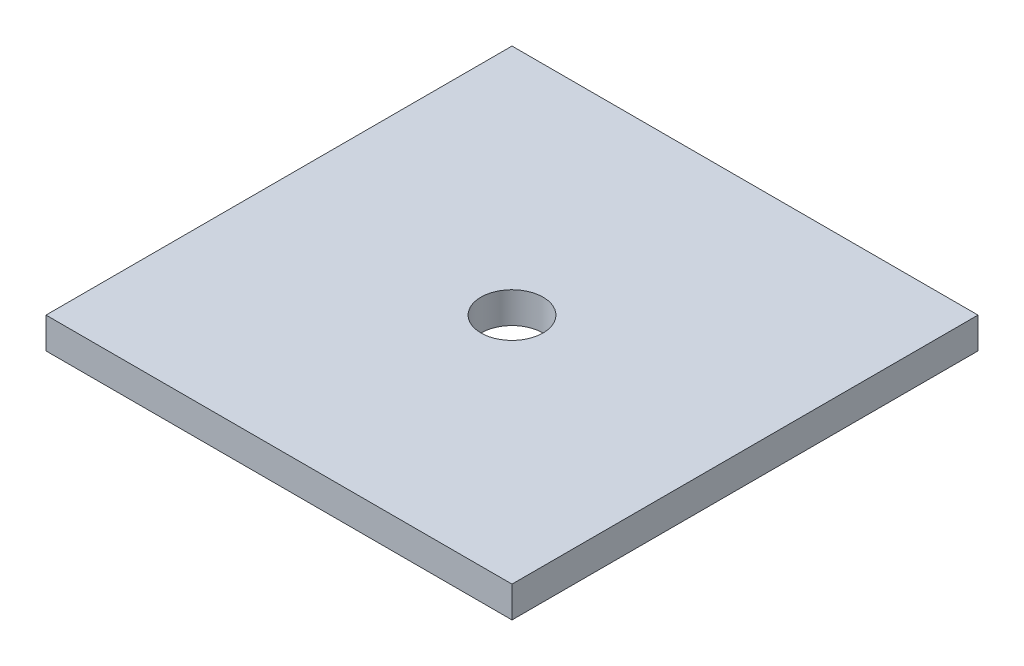
ISO-10303-21;
HEADER;
FILE_DESCRIPTION(('STEP AP214'),'2;1');
FILE_NAME('part.step','',(''),(''),'','','');
FILE_SCHEMA(('AUTOMOTIVE_DESIGN { 1 0 10303 214 1 1 1 1 }'));
ENDSEC;
DATA;
#1=APPLICATION_CONTEXT('core data for automotive mechanical design processes');
#2=APPLICATION_PROTOCOL_DEFINITION('international standard','automotive_design',2000,#1);
#3=PRODUCT_CONTEXT('',#1,'mechanical');
#4=PRODUCT('Part','Part','',(#3));
#5=PRODUCT_RELATED_PRODUCT_CATEGORY('part','',(#4));
#6=PRODUCT_DEFINITION_FORMATION('','',#4);
#7=PRODUCT_DEFINITION_CONTEXT('part definition',#1,'design');
#8=PRODUCT_DEFINITION('design','',#6,#7);
#9=PRODUCT_DEFINITION_SHAPE('','',#8);
#10=(LENGTH_UNIT() NAMED_UNIT(*) SI_UNIT(.MILLI.,.METRE.));
#11=(NAMED_UNIT(*) PLANE_ANGLE_UNIT() SI_UNIT($,.RADIAN.));
#12=(NAMED_UNIT(*) SI_UNIT($,.STERADIAN.) SOLID_ANGLE_UNIT());
#13=UNCERTAINTY_MEASURE_WITH_UNIT(LENGTH_MEASURE(1.E-05),#10,'distance_accuracy_value','');
#14=(GEOMETRIC_REPRESENTATION_CONTEXT(3) GLOBAL_UNCERTAINTY_ASSIGNED_CONTEXT((#13)) GLOBAL_UNIT_ASSIGNED_CONTEXT((#10,
#11,#12)) REPRESENTATION_CONTEXT('',''));
#15=CARTESIAN_POINT('',(0.,0.,0.));
#16=DIRECTION('',(0.,0.,1.));
#17=DIRECTION('',(1.,0.,0.));
#18=AXIS2_PLACEMENT_3D('',#15,#16,#17);
#19=CARTESIAN_POINT('',(0.,4.,0.));
#20=DIRECTION('',(0.,1.,0.));
#21=DIRECTION('',(0.,0.,1.));
#22=AXIS2_PLACEMENT_3D('',#19,#20,#21);
#23=PLANE('',#22);
#24=DIRECTION('',(0.,0.,1.));
#25=VECTOR('',#24,1.);
#26=CARTESIAN_POINT('',(-30.,4.,30.));
#27=LINE('',#26,#25);
#28=CARTESIAN_POINT('',(-30.,4.,-30.));
#29=VERTEX_POINT('',#28);
#30=CARTESIAN_POINT('',(-30.,4.,30.));
#31=VERTEX_POINT('',#30);
#32=EDGE_CURVE('E85',#29,#31,#27,.T.);
#33=ORIENTED_EDGE('',*,*,#32,.T.);
#34=DIRECTION('',(1.,0.,0.));
#35=VECTOR('',#34,1.);
#36=CARTESIAN_POINT('',(30.,4.,30.));
#37=LINE('',#36,#35);
#38=CARTESIAN_POINT('',(30.,4.,30.));
#39=VERTEX_POINT('',#38);
#40=EDGE_CURVE('E80',#31,#39,#37,.T.);
#41=ORIENTED_EDGE('',*,*,#40,.T.);
#42=DIRECTION('',(0.,0.,-1.));
#43=VECTOR('',#42,1.);
#44=CARTESIAN_POINT('',(30.,4.,30.));
#45=LINE('',#44,#43);
#46=CARTESIAN_POINT('',(30.,4.,-30.));
#47=VERTEX_POINT('',#46);
#48=EDGE_CURVE('E83',#39,#47,#45,.T.);
#49=ORIENTED_EDGE('',*,*,#48,.T.);
#50=DIRECTION('',(-1.,0.,0.));
#51=VECTOR('',#50,1.);
#52=CARTESIAN_POINT('',(30.,4.,-30.));
#53=LINE('',#52,#51);
#54=EDGE_CURVE('E50',#47,#29,#53,.T.);
#55=ORIENTED_EDGE('',*,*,#54,.T.);
#56=EDGE_LOOP('',(#33,#41,#49,#55));
#57=FACE_BOUND('',#56,.T.);
#58=CARTESIAN_POINT('',(0.,4.,0.));
#59=DIRECTION('',(0.,1.,0.));
#60=DIRECTION('',(0.,0.,1.));
#61=AXIS2_PLACEMENT_3D('',#58,#59,#60);
#62=CIRCLE('',#61,4.);
#63=CARTESIAN_POINT('',(0.,4.,4.));
#64=VERTEX_POINT('',#63);
#65=EDGE_CURVE('E100',#64,#64,#62,.T.);
#66=ORIENTED_EDGE('',*,*,#65,.F.);
#67=EDGE_LOOP('',(#66));
#68=FACE_BOUND('',#67,.T.);
#69=ADVANCED_FACE('F33',(#57,#68),#23,.T.);
#70=CARTESIAN_POINT('',(0.,0.,0.));
#71=DIRECTION('',(0.,1.,0.));
#72=DIRECTION('',(0.,0.,1.));
#73=AXIS2_PLACEMENT_3D('',#70,#71,#72);
#74=PLANE('',#73);
#75=DIRECTION('',(0.,0.,1.));
#76=VECTOR('',#75,1.);
#77=CARTESIAN_POINT('',(-30.,0.,30.));
#78=LINE('',#77,#76);
#79=CARTESIAN_POINT('',(-30.,0.,-30.));
#80=VERTEX_POINT('',#79);
#81=CARTESIAN_POINT('',(-30.,0.,30.));
#82=VERTEX_POINT('',#81);
#83=EDGE_CURVE('E97',#80,#82,#78,.T.);
#84=ORIENTED_EDGE('',*,*,#83,.F.);
#85=DIRECTION('',(-1.,0.,0.));
#86=VECTOR('',#85,1.);
#87=CARTESIAN_POINT('',(30.,0.,-30.));
#88=LINE('',#87,#86);
#89=CARTESIAN_POINT('',(30.,0.,-30.));
#90=VERTEX_POINT('',#89);
#91=EDGE_CURVE('E73',#90,#80,#88,.T.);
#92=ORIENTED_EDGE('',*,*,#91,.F.);
#93=DIRECTION('',(0.,0.,-1.));
#94=VECTOR('',#93,1.);
#95=CARTESIAN_POINT('',(30.,0.,30.));
#96=LINE('',#95,#94);
#97=CARTESIAN_POINT('',(30.,0.,30.));
#98=VERTEX_POINT('',#97);
#99=EDGE_CURVE('E67',#98,#90,#96,.T.);
#100=ORIENTED_EDGE('',*,*,#99,.F.);
#101=DIRECTION('',(1.,0.,0.));
#102=VECTOR('',#101,1.);
#103=CARTESIAN_POINT('',(30.,0.,30.));
#104=LINE('',#103,#102);
#105=EDGE_CURVE('E89',#82,#98,#104,.T.);
#106=ORIENTED_EDGE('',*,*,#105,.F.);
#107=EDGE_LOOP('',(#84,#92,#100,#106));
#108=FACE_BOUND('',#107,.T.);
#109=CARTESIAN_POINT('',(0.,0.,0.));
#110=DIRECTION('',(0.,1.,0.));
#111=DIRECTION('',(0.,0.,1.));
#112=AXIS2_PLACEMENT_3D('',#109,#110,#111);
#113=CIRCLE('',#112,4.);
#114=CARTESIAN_POINT('',(0.,0.,4.));
#115=VERTEX_POINT('',#114);
#116=EDGE_CURVE('E112',#115,#115,#113,.T.);
#117=ORIENTED_EDGE('',*,*,#116,.T.);
#118=EDGE_LOOP('',(#117));
#119=FACE_BOUND('',#118,.T.);
#120=ADVANCED_FACE('F108',(#108,#119),#74,.F.);
#121=CARTESIAN_POINT('',(-30.,4.,30.));
#122=DIRECTION('',(1.,0.,0.));
#123=DIRECTION('',(0.,0.,-1.));
#124=AXIS2_PLACEMENT_3D('',#121,#122,#123);
#125=PLANE('',#124);
#126=ORIENTED_EDGE('',*,*,#83,.T.);
#127=DIRECTION('',(0.,-1.,0.));
#128=VECTOR('',#127,1.);
#129=CARTESIAN_POINT('',(-30.,4.,30.));
#130=LINE('',#129,#128);
#131=EDGE_CURVE('E11',#31,#82,#130,.T.);
#132=ORIENTED_EDGE('',*,*,#131,.F.);
#133=ORIENTED_EDGE('',*,*,#32,.F.);
#134=DIRECTION('',(0.,-1.,0.));
#135=VECTOR('',#134,1.);
#136=CARTESIAN_POINT('',(-30.,4.,-30.));
#137=LINE('',#136,#135);
#138=EDGE_CURVE('E93',#29,#80,#137,.T.);
#139=ORIENTED_EDGE('',*,*,#138,.T.);
#140=EDGE_LOOP('',(#126,#132,#133,#139));
#141=FACE_BOUND('',#140,.T.);
#142=ADVANCED_FACE('F35',(#141),#125,.F.);
#143=CARTESIAN_POINT('',(30.,4.,30.));
#144=DIRECTION('',(0.,0.,-1.));
#145=DIRECTION('',(-1.,0.,0.));
#146=AXIS2_PLACEMENT_3D('',#143,#144,#145);
#147=PLANE('',#146);
#148=ORIENTED_EDGE('',*,*,#105,.T.);
#149=DIRECTION('',(0.,-1.,0.));
#150=VECTOR('',#149,1.);
#151=CARTESIAN_POINT('',(30.,4.,30.));
#152=LINE('',#151,#150);
#153=EDGE_CURVE('E42',#39,#98,#152,.T.);
#154=ORIENTED_EDGE('',*,*,#153,.F.);
#155=ORIENTED_EDGE('',*,*,#40,.F.);
#156=ORIENTED_EDGE('',*,*,#131,.T.);
#157=EDGE_LOOP('',(#148,#154,#155,#156));
#158=FACE_BOUND('',#157,.T.);
#159=ADVANCED_FACE('F88',(#158),#147,.F.);
#160=CARTESIAN_POINT('',(30.,4.,30.));
#161=DIRECTION('',(-1.,0.,0.));
#162=DIRECTION('',(0.,0.,1.));
#163=AXIS2_PLACEMENT_3D('',#160,#161,#162);
#164=PLANE('',#163);
#165=ORIENTED_EDGE('',*,*,#99,.T.);
#166=DIRECTION('',(0.,-1.,0.));
#167=VECTOR('',#166,1.);
#168=CARTESIAN_POINT('',(30.,4.,-30.));
#169=LINE('',#168,#167);
#170=EDGE_CURVE('E90',#47,#90,#169,.T.);
#171=ORIENTED_EDGE('',*,*,#170,.F.);
#172=ORIENTED_EDGE('',*,*,#48,.F.);
#173=ORIENTED_EDGE('',*,*,#153,.T.);
#174=EDGE_LOOP('',(#165,#171,#172,#173));
#175=FACE_BOUND('',#174,.T.);
#176=ADVANCED_FACE('F91',(#175),#164,.F.);
#177=CARTESIAN_POINT('',(30.,4.,-30.));
#178=DIRECTION('',(0.,0.,1.));
#179=DIRECTION('',(1.,0.,0.));
#180=AXIS2_PLACEMENT_3D('',#177,#178,#179);
#181=PLANE('',#180);
#182=ORIENTED_EDGE('',*,*,#91,.T.);
#183=ORIENTED_EDGE('',*,*,#138,.F.);
#184=ORIENTED_EDGE('',*,*,#54,.F.);
#185=ORIENTED_EDGE('',*,*,#170,.T.);
#186=EDGE_LOOP('',(#182,#183,#184,#185));
#187=FACE_BOUND('',#186,.T.);
#188=ADVANCED_FACE('F105',(#187),#181,.F.);
#189=CARTESIAN_POINT('',(0.,4.,0.));
#190=DIRECTION('',(0.,-1.,0.));
#191=DIRECTION('',(0.,0.,-1.));
#192=AXIS2_PLACEMENT_3D('',#189,#190,#191);
#193=CYLINDRICAL_SURFACE('',#192,4.);
#194=ORIENTED_EDGE('',*,*,#65,.T.);
#195=EDGE_LOOP('',(#194));
#196=FACE_BOUND('',#195,.T.);
#197=ORIENTED_EDGE('',*,*,#116,.F.);
#198=EDGE_LOOP('',(#197));
#199=FACE_BOUND('',#198,.T.);
#200=ADVANCED_FACE('F118',(#196,#199),#193,.F.);
#201=CLOSED_SHELL('',(#69,#120,#142,#159,#176,#188,#200));
#202=MANIFOLD_SOLID_BREP('B2',#201);
#203=ADVANCED_BREP_SHAPE_REPRESENTATION('',(#18,#202),#14);
#204=SHAPE_DEFINITION_REPRESENTATION(#9,#203);
ENDSEC;
END-ISO-10303-21;
